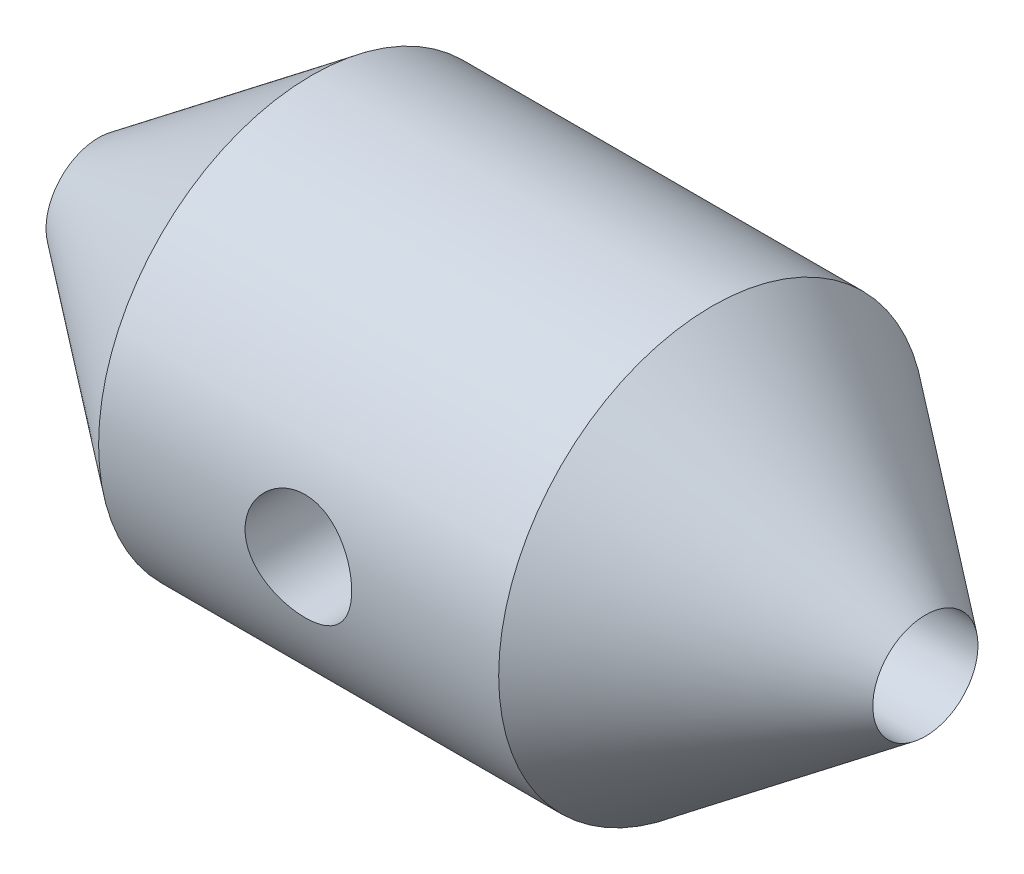
ISO-10303-21;
HEADER;
FILE_DESCRIPTION(('STEP AP214'),'2;1');
FILE_NAME('part.step','',(''),(''),'','','');
FILE_SCHEMA(('AUTOMOTIVE_DESIGN { 1 0 10303 214 1 1 1 1 }'));
ENDSEC;
DATA;
#1=APPLICATION_CONTEXT('core data for automotive mechanical design processes');
#2=APPLICATION_PROTOCOL_DEFINITION('international standard','automotive_design',2000,#1);
#3=PRODUCT_CONTEXT('',#1,'mechanical');
#4=PRODUCT('Part','Part','',(#3));
#5=PRODUCT_RELATED_PRODUCT_CATEGORY('part','',(#4));
#6=PRODUCT_DEFINITION_FORMATION('','',#4);
#7=PRODUCT_DEFINITION_CONTEXT('part definition',#1,'design');
#8=PRODUCT_DEFINITION('design','',#6,#7);
#9=PRODUCT_DEFINITION_SHAPE('','',#8);
#10=(LENGTH_UNIT() NAMED_UNIT(*) SI_UNIT(.MILLI.,.METRE.));
#11=(NAMED_UNIT(*) PLANE_ANGLE_UNIT() SI_UNIT($,.RADIAN.));
#12=(NAMED_UNIT(*) SI_UNIT($,.STERADIAN.) SOLID_ANGLE_UNIT());
#13=UNCERTAINTY_MEASURE_WITH_UNIT(LENGTH_MEASURE(1.E-05),#10,'distance_accuracy_value','');
#14=(GEOMETRIC_REPRESENTATION_CONTEXT(3) GLOBAL_UNCERTAINTY_ASSIGNED_CONTEXT((#13)) GLOBAL_UNIT_ASSIGNED_CONTEXT((#10,
#11,#12)) REPRESENTATION_CONTEXT('',''));
#15=CARTESIAN_POINT('',(0.,0.,0.));
#16=DIRECTION('',(0.,0.,1.));
#17=DIRECTION('',(1.,0.,0.));
#18=AXIS2_PLACEMENT_3D('',#15,#16,#17);
#19=CARTESIAN_POINT('',(190.5,0.,0.));
#20=DIRECTION('',(-1.,0.,0.));
#21=DIRECTION('',(0.,0.,1.));
#22=AXIS2_PLACEMENT_3D('',#19,#20,#21);
#23=CYLINDRICAL_SURFACE('',#22,25.4);
#24=CARTESIAN_POINT('',(95.1155053823793,0.,0.));
#25=DIRECTION('',(-0.707106781186547,0.,0.707106781186547));
#26=DIRECTION('',(-0.707106781186547,0.,-0.707106781186547));
#27=AXIS2_PLACEMENT_3D('',#24,#25,#26);
#28=ELLIPSE('',#27,35.9210244842766,25.4);
#29=CARTESIAN_POINT('',(95.1155053823793,25.4,0.));
#30=VERTEX_POINT('',#29);
#31=CARTESIAN_POINT('',(95.1155053823793,-25.4,0.));
#32=VERTEX_POINT('',#31);
#33=EDGE_CURVE('E72',#30,#32,#28,.F.);
#34=ORIENTED_EDGE('',*,*,#33,.F.);
#35=CARTESIAN_POINT('',(95.1155053823793,0.,0.));
#36=DIRECTION('',(-0.707106781186547,0.,-0.707106781186547));
#37=DIRECTION('',(-0.707106781186547,0.,0.707106781186547));
#38=AXIS2_PLACEMENT_3D('',#35,#36,#37);
#39=ELLIPSE('',#38,35.9210244842766,25.4);
#40=EDGE_CURVE('E63',#32,#30,#39,.F.);
#41=ORIENTED_EDGE('',*,*,#40,.F.);
#42=EDGE_LOOP('',(#34,#41));
#43=FACE_BOUND('',#42,.T.);
#44=CARTESIAN_POINT('',(190.5,0.,0.));
#45=DIRECTION('',(1.,0.,0.));
#46=DIRECTION('',(0.,0.,-1.));
#47=AXIS2_PLACEMENT_3D('',#44,#45,#46);
#48=CIRCLE('',#47,25.4);
#49=CARTESIAN_POINT('',(190.5,0.,-25.4));
#50=VERTEX_POINT('',#49);
#51=EDGE_CURVE('E108',#50,#50,#48,.T.);
#52=ORIENTED_EDGE('',*,*,#51,.T.);
#53=EDGE_LOOP('',(#52));
#54=FACE_BOUND('',#53,.T.);
#55=ADVANCED_FACE('F41',(#43,#54),#23,.F.);
#56=CARTESIAN_POINT('',(0.,0.,0.));
#57=DIRECTION('',(-1.,0.,0.));
#58=DIRECTION('',(0.,0.,1.));
#59=AXIS2_PLACEMENT_3D('',#56,#57,#58);
#60=PLANE('',#59);
#61=CARTESIAN_POINT('',(0.,0.,0.));
#62=DIRECTION('',(-1.,0.,0.));
#63=DIRECTION('',(0.,0.,1.));
#64=AXIS2_PLACEMENT_3D('',#61,#62,#63);
#65=CIRCLE('',#64,25.0389085095558);
#66=CARTESIAN_POINT('',(0.,0.,25.0389085095558));
#67=VERTEX_POINT('',#66);
#68=EDGE_CURVE('E96',#67,#67,#65,.T.);
#69=ORIENTED_EDGE('',*,*,#68,.T.);
#70=EDGE_LOOP('',(#69));
#71=FACE_BOUND('',#70,.T.);
#72=CARTESIAN_POINT('',(0.,0.,0.));
#73=DIRECTION('',(1.,0.,0.));
#74=DIRECTION('',(0.,0.,-1.));
#75=AXIS2_PLACEMENT_3D('',#72,#73,#74);
#76=CIRCLE('',#75,25.4);
#77=CARTESIAN_POINT('',(0.,0.,-25.4));
#78=VERTEX_POINT('',#77);
#79=EDGE_CURVE('E56',#78,#78,#76,.T.);
#80=ORIENTED_EDGE('',*,*,#79,.T.);
#81=EDGE_LOOP('',(#80));
#82=FACE_BOUND('',#81,.T.);
#83=ADVANCED_FACE('F133',(#71,#82),#60,.F.);
#84=CARTESIAN_POINT('',(190.5,0.,0.));
#85=DIRECTION('',(1.,0.,0.));
#86=DIRECTION('',(0.,0.,-1.));
#87=AXIS2_PLACEMENT_3D('',#84,#85,#86);
#88=PLANE('',#87);
#89=CARTESIAN_POINT('',(190.5,0.,0.));
#90=DIRECTION('',(1.,0.,0.));
#91=DIRECTION('',(0.,0.,-1.));
#92=AXIS2_PLACEMENT_3D('',#89,#90,#91);
#93=CIRCLE('',#92,25.0389085095558);
#94=CARTESIAN_POINT('',(190.5,0.,-25.0389085095558));
#95=VERTEX_POINT('',#94);
#96=EDGE_CURVE('E95',#95,#95,#93,.T.);
#97=ORIENTED_EDGE('',*,*,#96,.T.);
#98=EDGE_LOOP('',(#97));
#99=FACE_BOUND('',#98,.T.);
#100=ORIENTED_EDGE('',*,*,#51,.F.);
#101=EDGE_LOOP('',(#100));
#102=FACE_BOUND('',#101,.T.);
#103=ADVANCED_FACE('F118',(#99,#102),#88,.F.);
#104=CARTESIAN_POINT('',(95.1155053823793,0.,0.));
#105=DIRECTION('',(-0.707106781186547,0.,0.707106781186547));
#106=DIRECTION('',(-0.707106781186547,0.,-0.707106781186547));
#107=AXIS2_PLACEMENT_3D('',#104,#105,#106);
#108=ELLIPSE('',#107,35.9210244842766,25.4);
#109=EDGE_CURVE('E76',#30,#32,#108,.T.);
#110=ORIENTED_EDGE('',*,*,#109,.F.);
#111=CARTESIAN_POINT('',(95.1155053823793,0.,0.));
#112=DIRECTION('',(-0.707106781186547,0.,-0.707106781186547));
#113=DIRECTION('',(-0.707106781186547,0.,0.707106781186547));
#114=AXIS2_PLACEMENT_3D('',#111,#112,#113);
#115=ELLIPSE('',#114,35.9210244842766,25.4);
#116=EDGE_CURVE('E69',#32,#30,#115,.T.);
#117=ORIENTED_EDGE('',*,*,#116,.F.);
#118=EDGE_LOOP('',(#110,#117));
#119=FACE_BOUND('',#118,.T.);
#120=ORIENTED_EDGE('',*,*,#79,.F.);
#121=EDGE_LOOP('',(#120));
#122=FACE_BOUND('',#121,.T.);
#123=ADVANCED_FACE('F87',(#119,#122),#23,.F.);
#124=CARTESIAN_POINT('',(351.79,0.,0.));
#125=DIRECTION('',(-1.,0.,0.));
#126=DIRECTION('',(0.,0.,1.));
#127=AXIS2_PLACEMENT_3D('',#124,#125,#126);
#128=CYLINDRICAL_SURFACE('',#127,25.0389085095558);
#129=CARTESIAN_POINT('',(292.1,0.,0.));
#130=DIRECTION('',(1.,0.,0.));
#131=DIRECTION('',(0.,0.,-1.));
#132=AXIS2_PLACEMENT_3D('',#129,#130,#131);
#133=CIRCLE('',#132,25.0389085095558);
#134=CARTESIAN_POINT('',(292.1,0.,-25.0389085095558));
#135=VERTEX_POINT('',#134);
#136=EDGE_CURVE('E100',#135,#135,#133,.T.);
#137=ORIENTED_EDGE('',*,*,#136,.T.);
#138=EDGE_LOOP('',(#137));
#139=FACE_BOUND('',#138,.T.);
#140=ORIENTED_EDGE('',*,*,#96,.F.);
#141=EDGE_LOOP('',(#140));
#142=FACE_BOUND('',#141,.T.);
#143=ADVANCED_FACE('F121',(#139,#142),#128,.F.);
#144=CARTESIAN_POINT('',(-101.6,0.,0.));
#145=DIRECTION('',(-1.,0.,0.));
#146=DIRECTION('',(0.,0.,1.));
#147=AXIS2_PLACEMENT_3D('',#144,#145,#146);
#148=CIRCLE('',#147,25.0389085095558);
#149=CARTESIAN_POINT('',(-101.6,0.,25.0389085095558));
#150=VERTEX_POINT('',#149);
#151=EDGE_CURVE('E85',#150,#150,#148,.T.);
#152=ORIENTED_EDGE('',*,*,#151,.T.);
#153=EDGE_LOOP('',(#152));
#154=FACE_BOUND('',#153,.T.);
#155=ORIENTED_EDGE('',*,*,#68,.F.);
#156=EDGE_LOOP('',(#155));
#157=FACE_BOUND('',#156,.T.);
#158=ADVANCED_FACE('F123',(#154,#157),#128,.F.);
#159=CARTESIAN_POINT('',(190.5,0.,0.));
#160=DIRECTION('',(-1.,0.,0.));
#161=DIRECTION('',(0.,0.,1.));
#162=AXIS2_PLACEMENT_3D('',#159,#160,#161);
#163=CYLINDRICAL_SURFACE('',#162,101.6);
#164=CARTESIAN_POINT('',(120.515505382379,0.,101.6));
#165=CARTESIAN_POINT('',(120.515502421378,-0.70174278607514,101.599998342695));
#166=CARTESIAN_POINT('',(120.486399565777,-1.40354503327169,101.592711577929));
#167=CARTESIAN_POINT('',(120.370224380133,-2.80208096743986,101.563761885216));
#168=CARTESIAN_POINT('',(120.283145436083,-3.49881406694605,101.542097317027));
#169=CARTESIAN_POINT('',(120.051694937678,-4.88249004546404,101.484979059195));
#170=CARTESIAN_POINT('',(119.907294319916,-5.56942777468624,101.449518374787));
#171=CARTESIAN_POINT('',(119.562402099401,-6.92824540918229,101.365787174343));
#172=CARTESIAN_POINT('',(119.361911930436,-7.60012569888753,101.317516985751));
#173=CARTESIAN_POINT('',(118.90672431697,-8.92338902072216,101.209551481272));
#174=CARTESIAN_POINT('',(118.65209306015,-9.57479597547607,101.149870124476));
#175=CARTESIAN_POINT('',(118.090432524428,-10.8535908714085,101.020654460183));
#176=CARTESIAN_POINT('',(117.783402968039,-11.4809786853672,100.951120100508));
#177=CARTESIAN_POINT('',(117.119199457125,-12.707632240646,100.804056045135));
#178=CARTESIAN_POINT('',(116.76202547008,-13.3068979637286,100.726526344254));
#179=CARTESIAN_POINT('',(116.000035178468,-14.4734871268927,100.565525670275));
#180=CARTESIAN_POINT('',(115.59521821542,-15.0408101253292,100.482054615068));
#181=CARTESIAN_POINT('',(114.732753515248,-16.1501162268067,100.309793378494));
#182=CARTESIAN_POINT('',(114.274267170375,-16.6914366361186,100.220933373814));
#183=CARTESIAN_POINT('',(113.313777085057,-17.7337292861704,100.041763979507));
#184=CARTESIAN_POINT('',(112.811772830366,-18.2347010499802,99.9514545727632));
#185=CARTESIAN_POINT('',(111.767485993586,-19.1930674550841,99.7718594024423));
#186=CARTESIAN_POINT('',(111.225199064047,-19.6504573806771,99.6825737505562));
#187=CARTESIAN_POINT('',(110.103913024229,-20.5185368072815,99.5075161282614));
#188=CARTESIAN_POINT('',(109.52491370579,-20.9292260434625,99.42174417778));
#189=CARTESIAN_POINT('',(108.325087594067,-21.7068088660412,99.2548990490202));
#190=CARTESIAN_POINT('',(107.703766251176,-22.0729590305013,99.1739148844967));
#191=CARTESIAN_POINT('',(106.431400558171,-22.7514910363525,99.0204560653737));
#192=CARTESIAN_POINT('',(105.780355832971,-23.0638721989823,98.9479815182002));
#193=CARTESIAN_POINT('',(104.453166759698,-23.6323751939934,98.8137450099596));
#194=CARTESIAN_POINT('',(103.777025546138,-23.888504024747,98.751981716503));
#195=CARTESIAN_POINT('',(102.404432104714,-24.3424325630448,98.6410697211836));
#196=CARTESIAN_POINT('',(101.707980363807,-24.540233667769,98.5919207171624));
#197=CARTESIAN_POINT('',(100.314027989069,-24.872442697607,98.508630843525));
#198=CARTESIAN_POINT('',(99.6168277519768,-25.0080409733066,98.4742090929581));
#199=CARTESIAN_POINT('',(98.212959446539,-25.220423035763,98.4200300388889));
#200=CARTESIAN_POINT('',(97.5062914930791,-25.2972075355355,98.4002725576076));
#201=CARTESIAN_POINT('',(96.0888452596301,-25.3912788923103,98.3760404062525));
#202=CARTESIAN_POINT('',(95.378067577586,-25.4085741968357,98.3715635663136));
#203=CARTESIAN_POINT('',(93.9576392520513,-25.3835357304378,98.3780274603752));
#204=CARTESIAN_POINT('',(93.247988593027,-25.3412027886401,98.3889679799986));
#205=CARTESIAN_POINT('',(91.8522905901847,-25.1990375048316,98.4254728449525));
#206=CARTESIAN_POINT('',(91.1660884756547,-25.1006260159046,98.4506757221));
#207=CARTESIAN_POINT('',(89.804646056883,-24.8482206585007,98.5146834553788));
#208=CARTESIAN_POINT('',(89.1294055489589,-24.6942278240433,98.5534880584671));
#209=CARTESIAN_POINT('',(87.7944947500741,-24.3318959372293,98.6435686866571));
#210=CARTESIAN_POINT('',(87.1348252208294,-24.1235542321664,98.6948453204961));
#211=CARTESIAN_POINT('',(85.8354986126831,-23.6541464938227,98.808398484124));
#212=CARTESIAN_POINT('',(85.1958418491507,-23.3930796301605,98.8706751871537));
#213=CARTESIAN_POINT('',(83.9343795081995,-22.8172734822266,99.0051527276715));
#214=CARTESIAN_POINT('',(83.3128187223337,-22.5020199290274,99.0774472327889));
#215=CARTESIAN_POINT('',(82.0983751880993,-21.821976859596,99.2294444999203));
#216=CARTESIAN_POINT('',(81.5054925456397,-21.4571871604447,99.3091472892901));
#217=CARTESIAN_POINT('',(80.3520597868334,-20.6805258363991,99.4737824206017));
#218=CARTESIAN_POINT('',(79.7915144144148,-20.2686473297966,99.5587155260796));
#219=CARTESIAN_POINT('',(78.7063395978301,-19.4005694827554,99.7315081114057));
#220=CARTESIAN_POINT('',(78.1817108413505,-18.944369294105,99.8193676472376));
#221=CARTESIAN_POINT('',(77.157222891286,-17.9769436852281,99.9981912290038));
#222=CARTESIAN_POINT('',(76.6584980498322,-17.4645193802743,100.089172309723));
#223=CARTESIAN_POINT('',(75.7058501136137,-16.3992645701191,100.269216924574));
#224=CARTESIAN_POINT('',(75.251927894246,-15.8464332757739,100.358280421213));
#225=CARTESIAN_POINT('',(74.3919965715325,-14.7039910381679,100.532016941786));
#226=CARTESIAN_POINT('',(73.9859893437433,-14.1143786565495,100.616689793782));
#227=CARTESIAN_POINT('',(73.2248137657617,-12.9023149475724,100.779284015785));
#228=CARTESIAN_POINT('',(72.8696451055445,-12.2798638205034,100.857205426962));
#229=CARTESIAN_POINT('',(72.2116568953642,-11.0041178963534,101.004371401946));
#230=CARTESIAN_POINT('',(71.9090231538484,-10.3507236244452,101.073584938945));
#231=CARTESIAN_POINT('',(71.3600028514012,-9.01966582562865,101.201050180126));
#232=CARTESIAN_POINT('',(71.1136166064721,-8.34200216239789,101.259301822723));
#233=CARTESIAN_POINT('',(70.6791613723821,-6.96739379590874,101.363160890256));
#234=CARTESIAN_POINT('',(70.4910833067775,-6.27045211194648,101.408770283009));
#235=CARTESIAN_POINT('',(70.1748123526036,-4.8623536706211,101.486031610515));
#236=CARTESIAN_POINT('',(70.0466179876271,-4.15119726416676,101.517683889375));
#237=CARTESIAN_POINT('',(69.8537462221402,-2.73838603704628,101.565486205855));
#238=CARTESIAN_POINT('',(69.7875265844782,-2.03695414146569,101.582012409938));
#239=CARTESIAN_POINT('',(69.7135822959224,-0.630826734875681,101.600474397358));
#240=CARTESIAN_POINT('',(69.70585664711,0.0738687202515612,101.602410429605));
#241=CARTESIAN_POINT('',(69.7489640715717,1.48129185236139,101.591638389743));
#242=CARTESIAN_POINT('',(69.7997922896131,2.18401968765409,101.578931531809));
#243=CARTESIAN_POINT('',(69.9595619264071,3.58242507720991,101.539231404877));
#244=CARTESIAN_POINT('',(70.0685031179435,4.27810265902801,101.512238191738));
#245=CARTESIAN_POINT('',(70.3415287125701,5.64712612358302,101.445220249049));
#246=CARTESIAN_POINT('',(70.5047699454279,6.3206502271882,101.405395054002));
#247=CARTESIAN_POINT('',(70.8854451798381,7.65134609765034,101.313679822288));
#248=CARTESIAN_POINT('',(71.1028784816973,8.30851807551497,101.261789941392));
#249=CARTESIAN_POINT('',(71.5902797047397,9.60216511231365,101.147319112621));
#250=CARTESIAN_POINT('',(71.8602514977452,10.2386386418392,101.084737376852));
#251=CARTESIAN_POINT('',(72.4507259222928,11.486704568813,100.950530490872));
#252=CARTESIAN_POINT('',(72.771229486737,12.0982965066427,100.878905173707));
#253=CARTESIAN_POINT('',(73.4666199132767,13.3033156973491,100.727141889895));
#254=CARTESIAN_POINT('',(73.8423705869969,13.8962283131619,100.646875461425));
#255=CARTESIAN_POINT('',(74.6412362343307,15.0484476046029,100.481058292241));
#256=CARTESIAN_POINT('',(75.0643516676622,15.6077539539709,100.395507500241));
#257=CARTESIAN_POINT('',(75.9551702267567,16.689291430773,100.221393232785));
#258=CARTESIAN_POINT('',(76.4228800518885,17.2115169669705,100.132829305959));
#259=CARTESIAN_POINT('',(77.399790846244,18.2154895133509,99.9550694081982));
#260=CARTESIAN_POINT('',(77.9089924164552,18.6972359370085,99.8658734281258));
#261=CARTESIAN_POINT('',(78.9786368007937,19.6284630419471,99.6870792762544));
#262=CARTESIAN_POINT('',(79.5400314548059,20.0768596191044,99.5975251052974));
#263=CARTESIAN_POINT('',(80.6992442470906,20.9247967854774,99.4228360944774));
#264=CARTESIAN_POINT('',(81.2970630497557,21.3243364831222,99.3377013352789));
#265=CARTESIAN_POINT('',(82.5251055673589,22.0716662869697,99.1743309035128));
#266=CARTESIAN_POINT('',(83.1553285228473,22.4194576052456,99.0960950693731));
#267=CARTESIAN_POINT('',(84.4438896497578,23.0606695281118,98.9488443659511));
#268=CARTESIAN_POINT('',(85.1022274298968,23.3540908890832,98.8798293683948));
#269=CARTESIAN_POINT('',(86.4383916717997,23.8826456439094,98.7534945515884));
#270=CARTESIAN_POINT('',(87.1160775042555,24.1181181965157,98.6961070469757));
#271=CARTESIAN_POINT('',(88.4898472960433,24.5311044132267,98.5942706694346));
#272=CARTESIAN_POINT('',(89.1859312295891,24.7086181585602,98.5498217783728));
#273=CARTESIAN_POINT('',(90.5912490471024,25.0041309923959,98.4752592946707));
#274=CARTESIAN_POINT('',(91.3004804933472,25.1221410014834,98.4451430716453));
#275=CARTESIAN_POINT('',(92.726867339517,25.297642479101,98.4001907155776));
#276=CARTESIAN_POINT('',(93.4440225483804,25.3551354036449,98.3853542149123));
#277=CARTESIAN_POINT('',(94.860102157408,25.4083114399671,98.3716341424296));
#278=CARTESIAN_POINT('',(95.5589578669406,25.4057241965766,98.3723041525636));
#279=CARTESIAN_POINT('',(96.9538987260964,25.3430016949837,98.3884816265206));
#280=CARTESIAN_POINT('',(97.6499839314947,25.2828676012467,98.4039887901123));
#281=CARTESIAN_POINT('',(99.0343519992414,25.105569507893,98.4493713684074));
#282=CARTESIAN_POINT('',(99.7226350685564,24.9884070247041,98.4792464010579));
#283=CARTESIAN_POINT('',(101.086539949988,24.6980341944056,98.5524707385945));
#284=CARTESIAN_POINT('',(101.762161698615,24.5248235663289,98.5958201110267));
#285=CARTESIAN_POINT('',(103.092061352203,24.1249624516609,98.6944186809912));
#286=CARTESIAN_POINT('',(103.746442835353,23.8986381587135,98.7495950713613));
#287=CARTESIAN_POINT('',(105.033711996618,23.3937423520378,98.8704209837864));
#288=CARTESIAN_POINT('',(105.666599828688,23.1151712126362,98.9360704308059));
#289=CARTESIAN_POINT('',(106.906867861499,22.5077903148963,99.0760134970338));
#290=CARTESIAN_POINT('',(107.514245334183,22.1789752008595,99.1503080375544));
#291=CARTESIAN_POINT('',(108.699610906816,21.4734215369939,99.3055012980325));
#292=CARTESIAN_POINT('',(109.277598379811,21.0966819654308,99.3864001587787));
#293=CARTESIAN_POINT('',(110.415273028533,20.2873619405319,99.5547997477337));
#294=CARTESIAN_POINT('',(110.97408907844,19.8535808601619,99.6424176636516));
#295=CARTESIAN_POINT('',(112.053415421196,18.9411352581313,99.8198845423111));
#296=CARTESIAN_POINT('',(112.573925030098,18.4624699354264,99.9097335448496));
#297=CARTESIAN_POINT('',(113.573378241853,17.4632859029751,100.089216620991));
#298=CARTESIAN_POINT('',(114.052312251843,16.9427575871445,100.178850640375));
#299=CARTESIAN_POINT('',(114.965315023321,15.8633147116657,100.355439744904));
#300=CARTESIAN_POINT('',(115.39938381992,15.3044001820577,100.442394832144));
#301=CARTESIAN_POINT('',(116.227149952436,14.1413268210189,100.612794779806));
#302=CARTESIAN_POINT('',(116.61997226511,13.5365312406867,100.696147369069));
#303=CARTESIAN_POINT('',(117.353177243849,12.2949475803669,100.855272129559));
#304=CARTESIAN_POINT('',(117.693557441341,11.6581579962168,100.931043943881));
#305=CARTESIAN_POINT('',(118.319036334631,10.3574423174831,101.072800928001));
#306=CARTESIAN_POINT('',(118.604170271658,9.69353385134363,101.138792330301));
#307=CARTESIAN_POINT('',(119.11710010326,8.34296365249743,101.259144314005));
#308=CARTESIAN_POINT('',(119.344904647424,7.65630536988815,101.313506649762));
#309=CARTESIAN_POINT('',(119.703884117224,6.39656278651798,101.400020453084));
#310=CARTESIAN_POINT('',(119.845181145933,5.82649312693267,101.434427344593));
#311=CARTESIAN_POINT('',(120.088046751131,4.67729724243728,101.493910715531));
#312=CARTESIAN_POINT('',(120.18960554649,4.09816882424707,101.518984897743));
#313=CARTESIAN_POINT('',(120.352330281262,2.93395882726431,101.55929848259));
#314=CARTESIAN_POINT('',(120.413498637559,2.34887760680328,101.574538473684));
#315=CARTESIAN_POINT('',(120.495082119892,1.17587765200842,101.594888607128));
#316=CARTESIAN_POINT('',(120.515507863273,0.587959696958222,101.600001388583));
#317=CARTESIAN_POINT('',(120.515505382379,0.,101.6));
#318=B_SPLINE_CURVE_WITH_KNOTS('',3,(#164,#165,#166,#167,#168,#169,#170,#171,#172,#173,#174,
#175,#176,#177,#178,#179,#180,#181,#182,#183,#184,#185,#186,#187,#188,#189,#190,#191,#192,#193,
#194,#195,#196,#197,#198,#199,#200,#201,#202,#203,#204,#205,#206,#207,#208,#209,#210,#211,#212,
#213,#214,#215,#216,#217,#218,#219,#220,#221,#222,#223,#224,#225,#226,#227,#228,#229,#230,#231,
#232,#233,#234,#235,#236,#237,#238,#239,#240,#241,#242,#243,#244,#245,#246,#247,#248,#249,#250,
#251,#252,#253,#254,#255,#256,#257,#258,#259,#260,#261,#262,#263,#264,#265,#266,#267,#268,#269,
#270,#271,#272,#273,#274,#275,#276,#277,#278,#279,#280,#281,#282,#283,#284,#285,#286,#287,#288,
#289,#290,#291,#292,#293,#294,#295,#296,#297,#298,#299,#300,#301,#302,#303,#304,#305,#306,#307,
#308,#309,#310,#311,#312,#313,#314,#315,#316,#317),.UNSPECIFIED.,.T.,.F.,(4,2,2,2,2,2,2,2,2,2,2,
2,2,2,2,2,2,2,2,2,2,2,2,2,2,2,2,2,2,2,2,2,2,2,2,2,2,2,2,2,2,2,2,2,2,2,2,2,2,2,2,2,2,2,2,2,2,2,2,
2,2,2,2,2,2,2,2,2,2,2,2,2,2,2,2,2,4),(0.,2.1046924869389,4.20962512173835,6.31562637173173,
8.42157379202584,10.5249613360018,12.628360019244,14.7317600665605,16.835189188674,
18.9775199159957,21.1198759624431,23.2624635563913,25.4050632999348,27.5795759117777,
29.7541159719072,31.9283853433035,34.1026026281098,36.2332725678713,38.3639166765197,
40.4942582191564,42.6245701398662,44.7031648263533,46.7817208452492,48.8603783350845,
50.9390685647578,53.0387024162454,55.1383440211353,57.2382928675184,59.3382819098526,
61.4982085582216,63.658177400982,65.8182307642869,67.9782709545535,70.1458017745024,
72.3133447714893,74.4805501919651,76.64770217809,78.7593668420276,80.870995480479,
82.982449037232,85.0938943384625,87.1739749277109,89.2540286616851,91.3342357432383,
93.414481233434,95.5316262562954,97.6487918297511,99.7662759654162,101.883790777245,
104.053352299935,106.222953408237,108.392503691185,110.562023789629,112.718527000497,
114.875027189027,117.031131455798,119.187183846487,121.281244784891,123.375263350686,
125.469226237993,127.56319962241,129.644634855996,131.726055177538,133.807697520648,
135.889384251156,138.025392577804,140.161439032821,142.297977041548,144.434513378286,
146.609800790187,148.785190566681,150.95918807439,153.132857382693,154.896418967232,
156.660414360469,158.424304190179,160.187734297857),.UNSPECIFIED.);
#319=CARTESIAN_POINT('',(120.515505382379,0.,101.6));
#320=VERTEX_POINT('',#319);
#321=EDGE_CURVE('E46',#320,#320,#318,.T.);
#322=ORIENTED_EDGE('',*,*,#321,.T.);
#323=EDGE_LOOP('',(#322));
#324=FACE_BOUND('',#323,.T.);
#325=CARTESIAN_POINT('',(190.5,0.,0.));
#326=DIRECTION('',(1.,0.,0.));
#327=DIRECTION('',(0.,0.,-1.));
#328=AXIS2_PLACEMENT_3D('',#325,#326,#327);
#329=CIRCLE('',#328,101.6);
#330=CARTESIAN_POINT('',(190.5,0.,-101.6));
#331=VERTEX_POINT('',#330);
#332=EDGE_CURVE('E11',#331,#331,#329,.T.);
#333=ORIENTED_EDGE('',*,*,#332,.F.);
#334=EDGE_LOOP('',(#333));
#335=FACE_BOUND('',#334,.T.);
#336=CARTESIAN_POINT('',(0.,0.,0.));
#337=DIRECTION('',(-1.,0.,0.));
#338=DIRECTION('',(0.,0.,1.));
#339=AXIS2_PLACEMENT_3D('',#336,#337,#338);
#340=CIRCLE('',#339,101.6);
#341=CARTESIAN_POINT('',(0.,0.,101.6));
#342=VERTEX_POINT('',#341);
#343=EDGE_CURVE('E104',#342,#342,#340,.T.);
#344=ORIENTED_EDGE('',*,*,#343,.F.);
#345=EDGE_LOOP('',(#344));
#346=FACE_BOUND('',#345,.T.);
#347=ADVANCED_FACE('F43',(#324,#335,#346),#163,.T.);
#348=CARTESIAN_POINT('',(190.5,0.,0.));
#349=DIRECTION('',(-1.,0.,0.));
#350=DIRECTION('',(0.,0.,-1.));
#351=AXIS2_PLACEMENT_3D('',#348,#349,#350);
#352=CONICAL_SURFACE('',#351,101.6,0.645771823237902);
#353=CARTESIAN_POINT('',(292.1,0.,-25.0389085095558));
#354=CARTESIAN_POINT('',(291.041666666667,0.,-25.8364198792479));
#355=CARTESIAN_POINT('',(289.983333333334,0.,-26.63393124894));
#356=CARTESIAN_POINT('',(287.866666666667,0.,-28.2289539883243));
#357=CARTESIAN_POINT('',(286.808333333334,0.,-29.0264653580164));
#358=CARTESIAN_POINT('',(284.691666666667,0.,-30.6214880974007));
#359=CARTESIAN_POINT('',(283.633333333334,0.,-31.4189994670928));
#360=CARTESIAN_POINT('',(281.516666666667,0.,-33.0140222064771));
#361=CARTESIAN_POINT('',(280.458333333334,0.,-33.8115335761692));
#362=CARTESIAN_POINT('',(278.341666666667,0.,-35.4065563155534));
#363=CARTESIAN_POINT('',(277.283333333334,0.,-36.2040676852456));
#364=CARTESIAN_POINT('',(275.166666666667,0.,-37.7990904246298));
#365=CARTESIAN_POINT('',(274.108333333334,0.,-38.5966017943219));
#366=CARTESIAN_POINT('',(271.991666666667,0.,-40.1916245337062));
#367=CARTESIAN_POINT('',(270.933333333334,0.,-40.9891359033983));
#368=CARTESIAN_POINT('',(268.816666666667,0.,-42.5841586427826));
#369=CARTESIAN_POINT('',(267.758333333334,0.,-43.3816700124747));
#370=CARTESIAN_POINT('',(265.641666666667,0.,-44.976692751859));
#371=CARTESIAN_POINT('',(264.583333333334,0.,-45.7742041215511));
#372=CARTESIAN_POINT('',(262.466666666667,0.,-47.3692268609353));
#373=CARTESIAN_POINT('',(261.408333333334,0.,-48.1667382306275));
#374=CARTESIAN_POINT('',(259.291666666667,0.,-49.7617609700117));
#375=CARTESIAN_POINT('',(258.233333333334,0.,-50.5592723397038));
#376=CARTESIAN_POINT('',(256.116666666667,0.,-52.1542950790881));
#377=CARTESIAN_POINT('',(255.058333333334,0.,-52.9518064487802));
#378=CARTESIAN_POINT('',(252.941666666667,0.,-54.5468291881645));
#379=CARTESIAN_POINT('',(251.883333333334,0.,-55.3443405578566));
#380=CARTESIAN_POINT('',(249.766666666667,0.,-56.9393632972409));
#381=CARTESIAN_POINT('',(248.708333333334,0.,-57.736874666933));
#382=CARTESIAN_POINT('',(246.591666666667,0.,-59.3318974063172));
#383=CARTESIAN_POINT('',(245.533333333334,0.,-60.1294087760094));
#384=CARTESIAN_POINT('',(243.416666666667,0.,-61.7244315153936));
#385=CARTESIAN_POINT('',(242.358333333333,0.,-62.5219428850858));
#386=CARTESIAN_POINT('',(240.241666666667,0.,-64.11696562447));
#387=CARTESIAN_POINT('',(239.183333333333,0.,-64.9144769941622));
#388=CARTESIAN_POINT('',(237.066666666667,0.,-66.5094997335464));
#389=CARTESIAN_POINT('',(236.008333333333,0.,-67.3070111032385));
#390=CARTESIAN_POINT('',(233.891666666667,0.,-68.9020338426228));
#391=CARTESIAN_POINT('',(232.833333333333,0.,-69.6995452123149));
#392=CARTESIAN_POINT('',(230.716666666667,0.,-71.2945679516992));
#393=CARTESIAN_POINT('',(229.658333333333,0.,-72.0920793213913));
#394=CARTESIAN_POINT('',(227.541666666667,0.,-73.6871020607755));
#395=CARTESIAN_POINT('',(226.483333333333,0.,-74.4846134304677));
#396=CARTESIAN_POINT('',(224.366666666667,0.,-76.0796361698519));
#397=CARTESIAN_POINT('',(223.308333333333,0.,-76.8771475395441));
#398=CARTESIAN_POINT('',(221.191666666667,0.,-78.4721702789283));
#399=CARTESIAN_POINT('',(220.133333333333,0.,-79.2696816486204));
#400=CARTESIAN_POINT('',(218.016666666667,0.,-80.8647043880047));
#401=CARTESIAN_POINT('',(216.958333333333,0.,-81.6622157576968));
#402=CARTESIAN_POINT('',(214.841666666667,0.,-83.2572384970811));
#403=CARTESIAN_POINT('',(213.783333333333,0.,-84.0547498667732));
#404=CARTESIAN_POINT('',(211.666666666667,0.,-85.6497726061575));
#405=CARTESIAN_POINT('',(210.608333333333,0.,-86.4472839758496));
#406=CARTESIAN_POINT('',(208.491666666667,0.,-88.0423067152338));
#407=CARTESIAN_POINT('',(207.433333333333,0.,-88.839818084926));
#408=CARTESIAN_POINT('',(205.316666666667,0.,-90.4348408243102));
#409=CARTESIAN_POINT('',(204.258333333333,0.,-91.2323521940023));
#410=CARTESIAN_POINT('',(202.141666666667,0.,-92.8273749333866));
#411=CARTESIAN_POINT('',(201.083333333333,0.,-93.6248863030787));
#412=CARTESIAN_POINT('',(198.966666666667,0.,-95.219909042463));
#413=CARTESIAN_POINT('',(197.908333333333,0.,-96.0174204121551));
#414=CARTESIAN_POINT('',(195.791666666667,0.,-97.6124431515394));
#415=CARTESIAN_POINT('',(194.733333333333,0.,-98.4099545212315));
#416=CARTESIAN_POINT('',(192.616666666667,0.,-100.004977260616));
#417=CARTESIAN_POINT('',(191.558333333333,0.,-100.802488630308));
#418=CARTESIAN_POINT('',(190.5,0.,-101.6));
#419=B_SPLINE_CURVE_WITH_KNOTS('',3,(#353,#354,#355,#356,#357,#358,#359,#360,#361,#362,#363,
#364,#365,#366,#367,#368,#369,#370,#371,#372,#373,#374,#375,#376,#377,#378,#379,#380,#381,#382,
#383,#384,#385,#386,#387,#388,#389,#390,#391,#392,#393,#394,#395,#396,#397,#398,#399,#400,#401,
#402,#403,#404,#405,#406,#407,#408,#409,#410,#411,#412,#413,#414,#415,#416,#417,#418),
.UNSPECIFIED.,.F.,.F.,(4,2,2,2,2,2,2,2,2,2,2,2,2,2,2,2,2,2,2,2,2,2,2,2,2,2,2,2,2,2,2,2,4),(0.,
3.97553071464605,7.95106142929211,11.9265921439381,15.9021228585841,19.8776535732302,
23.8531842878762,27.8287150025222,31.8042457171683,35.7797764318143,39.7553071464604,
43.7308378611064,47.7063685757524,51.6818992903984,55.6574300050445,59.6329607196905,
63.6084914343365,67.5840221489826,71.5595528636286,75.5350835782746,79.5106142929206,
83.4861450075667,87.4616757222127,91.4372064368588,95.4127371515048,99.3882678661508,
103.363798580797,107.339329295443,111.314860010089,115.290390724735,119.265921439381,
123.241452154027,127.216982868673),.UNSPECIFIED.);
#420=EDGE_CURVE('BSEAM139',#135,#331,#419,.T.);
#421=ORIENTED_EDGE('',*,*,#136,.F.);
#422=ORIENTED_EDGE('',*,*,#332,.T.);
#423=ORIENTED_EDGE('',*,*,#420,.T.);
#424=ORIENTED_EDGE('',*,*,#420,.F.);
#425=EDGE_LOOP('',(#421,#423,#422,#424));
#426=FACE_BOUND('',#425,.T.);
#427=ADVANCED_FACE('F139',(#426),#352,.T.);
#428=CARTESIAN_POINT('',(0.,0.,0.));
#429=DIRECTION('',(1.,0.,0.));
#430=DIRECTION('',(0.,0.,1.));
#431=AXIS2_PLACEMENT_3D('',#428,#429,#430);
#432=CONICAL_SURFACE('',#431,101.6,0.645771823237902);
#433=CARTESIAN_POINT('',(-101.6,0.,25.0389085095558));
#434=CARTESIAN_POINT('',(-100.541666666667,0.,25.8364198792479));
#435=CARTESIAN_POINT('',(-99.4833333333337,0.,26.63393124894));
#436=CARTESIAN_POINT('',(-97.366666666667,0.,28.2289539883243));
#437=CARTESIAN_POINT('',(-96.3083333333336,0.,29.0264653580164));
#438=CARTESIAN_POINT('',(-94.191666666667,0.,30.6214880974007));
#439=CARTESIAN_POINT('',(-93.1333333333336,0.,31.4189994670928));
#440=CARTESIAN_POINT('',(-91.0166666666669,0.,33.0140222064771));
#441=CARTESIAN_POINT('',(-89.9583333333336,0.,33.8115335761692));
#442=CARTESIAN_POINT('',(-87.8416666666669,0.,35.4065563155534));
#443=CARTESIAN_POINT('',(-86.7833333333336,0.,36.2040676852456));
#444=CARTESIAN_POINT('',(-84.6666666666669,0.,37.7990904246298));
#445=CARTESIAN_POINT('',(-83.6083333333336,0.,38.5966017943219));
#446=CARTESIAN_POINT('',(-81.4916666666669,0.,40.1916245337062));
#447=CARTESIAN_POINT('',(-80.4333333333336,0.,40.9891359033983));
#448=CARTESIAN_POINT('',(-78.3166666666669,0.,42.5841586427826));
#449=CARTESIAN_POINT('',(-77.2583333333336,0.,43.3816700124747));
#450=CARTESIAN_POINT('',(-75.1416666666669,0.,44.976692751859));
#451=CARTESIAN_POINT('',(-74.0833333333336,0.,45.7742041215511));
#452=CARTESIAN_POINT('',(-71.9666666666669,0.,47.3692268609353));
#453=CARTESIAN_POINT('',(-70.9083333333336,0.,48.1667382306275));
#454=CARTESIAN_POINT('',(-68.7916666666669,0.,49.7617609700117));
#455=CARTESIAN_POINT('',(-67.7333333333335,0.,50.5592723397039));
#456=CARTESIAN_POINT('',(-65.6166666666669,0.,52.1542950790881));
#457=CARTESIAN_POINT('',(-64.5583333333335,0.,52.9518064487802));
#458=CARTESIAN_POINT('',(-62.4416666666669,0.,54.5468291881645));
#459=CARTESIAN_POINT('',(-61.3833333333335,0.,55.3443405578566));
#460=CARTESIAN_POINT('',(-59.2666666666669,0.,56.9393632972409));
#461=CARTESIAN_POINT('',(-58.2083333333335,0.,57.736874666933));
#462=CARTESIAN_POINT('',(-56.0916666666669,0.,59.3318974063172));
#463=CARTESIAN_POINT('',(-55.0333333333335,0.,60.1294087760094));
#464=CARTESIAN_POINT('',(-52.9166666666668,0.,61.7244315153936));
#465=CARTESIAN_POINT('',(-51.8583333333335,0.,62.5219428850858));
#466=CARTESIAN_POINT('',(-49.7416666666668,0.,64.11696562447));
#467=CARTESIAN_POINT('',(-48.6833333333335,0.,64.9144769941621));
#468=CARTESIAN_POINT('',(-46.5666666666668,0.,66.5094997335464));
#469=CARTESIAN_POINT('',(-45.5083333333335,0.,67.3070111032385));
#470=CARTESIAN_POINT('',(-43.3916666666668,0.,68.9020338426228));
#471=CARTESIAN_POINT('',(-42.3333333333335,0.,69.6995452123149));
#472=CARTESIAN_POINT('',(-40.2166666666668,0.,71.2945679516992));
#473=CARTESIAN_POINT('',(-39.1583333333335,0.,72.0920793213913));
#474=CARTESIAN_POINT('',(-37.0416666666668,0.,73.6871020607755));
#475=CARTESIAN_POINT('',(-35.9833333333334,0.,74.4846134304677));
#476=CARTESIAN_POINT('',(-33.8666666666668,0.,76.0796361698519));
#477=CARTESIAN_POINT('',(-32.8083333333334,0.,76.8771475395441));
#478=CARTESIAN_POINT('',(-30.6916666666668,0.,78.4721702789283));
#479=CARTESIAN_POINT('',(-29.6333333333334,0.,79.2696816486204));
#480=CARTESIAN_POINT('',(-27.5166666666668,0.,80.8647043880047));
#481=CARTESIAN_POINT('',(-26.4583333333334,0.,81.6622157576968));
#482=CARTESIAN_POINT('',(-24.3416666666668,0.,83.257238497081));
#483=CARTESIAN_POINT('',(-23.2833333333334,0.,84.0547498667732));
#484=CARTESIAN_POINT('',(-21.1666666666667,0.,85.6497726061574));
#485=CARTESIAN_POINT('',(-20.1083333333334,0.,86.4472839758496));
#486=CARTESIAN_POINT('',(-17.9916666666667,0.,88.0423067152338));
#487=CARTESIAN_POINT('',(-16.9333333333334,0.,88.839818084926));
#488=CARTESIAN_POINT('',(-14.8166666666667,0.,90.4348408243102));
#489=CARTESIAN_POINT('',(-13.7583333333334,0.,91.2323521940023));
#490=CARTESIAN_POINT('',(-11.6416666666667,0.,92.8273749333866));
#491=CARTESIAN_POINT('',(-10.5833333333334,0.,93.6248863030787));
#492=CARTESIAN_POINT('',(-8.4666666666667,0.,95.219909042463));
#493=CARTESIAN_POINT('',(-7.40833333333336,0.,96.0174204121551));
#494=CARTESIAN_POINT('',(-5.29166666666669,0.,97.6124431515394));
#495=CARTESIAN_POINT('',(-4.23333333333335,0.,98.4099545212315));
#496=CARTESIAN_POINT('',(-2.11666666666667,0.,100.004977260616));
#497=CARTESIAN_POINT('',(-1.05833333333333,0.,100.802488630308));
#498=CARTESIAN_POINT('',(0.,0.,101.6));
#499=B_SPLINE_CURVE_WITH_KNOTS('',3,(#433,#434,#435,#436,#437,#438,#439,#440,#441,#442,#443,
#444,#445,#446,#447,#448,#449,#450,#451,#452,#453,#454,#455,#456,#457,#458,#459,#460,#461,#462,
#463,#464,#465,#466,#467,#468,#469,#470,#471,#472,#473,#474,#475,#476,#477,#478,#479,#480,#481,
#482,#483,#484,#485,#486,#487,#488,#489,#490,#491,#492,#493,#494,#495,#496,#497,#498),
.UNSPECIFIED.,.F.,.F.,(4,2,2,2,2,2,2,2,2,2,2,2,2,2,2,2,2,2,2,2,2,2,2,2,2,2,2,2,2,2,2,2,4),(0.,
3.97553071464603,7.95106142929206,11.9265921439381,15.9021228585841,19.8776535732302,
23.8531842878762,27.8287150025222,31.8042457171682,35.7797764318143,39.7553071464603,
43.7308378611063,47.7063685757524,51.6818992903984,55.6574300050444,59.6329607196904,
63.6084914343365,67.5840221489825,71.5595528636285,75.5350835782746,79.5106142929206,
83.4861450075666,87.4616757222127,91.4372064368587,95.4127371515047,99.3882678661508,
103.363798580797,107.339329295443,111.314860010089,115.290390724735,119.265921439381,
123.241452154027,127.216982868673),.UNSPECIFIED.);
#500=EDGE_CURVE('BSEAM142',#150,#342,#499,.T.);
#501=ORIENTED_EDGE('',*,*,#151,.F.);
#502=ORIENTED_EDGE('',*,*,#343,.T.);
#503=ORIENTED_EDGE('',*,*,#500,.T.);
#504=ORIENTED_EDGE('',*,*,#500,.F.);
#505=EDGE_LOOP('',(#501,#503,#502,#504));
#506=FACE_BOUND('',#505,.T.);
#507=ADVANCED_FACE('F142',(#506),#432,.T.);
#508=CARTESIAN_POINT('',(95.1155053823793,0.,-97.7900000000004));
#509=DIRECTION('',(0.,0.,1.));
#510=DIRECTION('',(1.,0.,0.));
#511=AXIS2_PLACEMENT_3D('',#508,#509,#510);
#512=CYLINDRICAL_SURFACE('',#511,25.4);
#513=ORIENTED_EDGE('',*,*,#33,.T.);
#514=ORIENTED_EDGE('',*,*,#116,.T.);
#515=EDGE_LOOP('',(#513,#514));
#516=FACE_BOUND('',#515,.T.);
#517=ORIENTED_EDGE('',*,*,#321,.F.);
#518=EDGE_LOOP('',(#517));
#519=FACE_BOUND('',#518,.T.);
#520=ADVANCED_FACE('F70',(#516,#519),#512,.F.);
#521=ORIENTED_EDGE('',*,*,#109,.T.);
#522=ORIENTED_EDGE('',*,*,#40,.T.);
#523=EDGE_LOOP('',(#521,#522));
#524=FACE_BOUND('',#523,.T.);
#525=CARTESIAN_POINT('',(95.1155053823793,0.,-97.7900000000004));
#526=DIRECTION('',(0.,0.,1.));
#527=DIRECTION('',(1.,0.,0.));
#528=AXIS2_PLACEMENT_3D('',#525,#526,#527);
#529=CIRCLE('',#528,25.4);
#530=CARTESIAN_POINT('',(120.515505382379,0.,-97.7900000000004));
#531=VERTEX_POINT('',#530);
#532=EDGE_CURVE('E165',#531,#531,#529,.T.);
#533=ORIENTED_EDGE('',*,*,#532,.F.);
#534=EDGE_LOOP('',(#533));
#535=FACE_BOUND('',#534,.T.);
#536=ADVANCED_FACE('F79',(#524,#535),#512,.F.);
#537=CARTESIAN_POINT('',(95.1155053823793,0.,-97.7900000000004));
#538=DIRECTION('',(0.,0.,1.));
#539=DIRECTION('',(1.,0.,0.));
#540=AXIS2_PLACEMENT_3D('',#537,#538,#539);
#541=PLANE('',#540);
#542=ORIENTED_EDGE('',*,*,#532,.T.);
#543=EDGE_LOOP('',(#542));
#544=FACE_BOUND('',#543,.T.);
#545=ADVANCED_FACE('F171',(#544),#541,.T.);
#546=CLOSED_SHELL('',(#55,#83,#103,#123,#143,#158,#347,#427,#507,#520,#536,#545));
#547=MANIFOLD_SOLID_BREP('B2',#546);
#548=ADVANCED_BREP_SHAPE_REPRESENTATION('',(#18,#547),#14);
#549=SHAPE_DEFINITION_REPRESENTATION(#9,#548);
ENDSEC;
END-ISO-10303-21;
